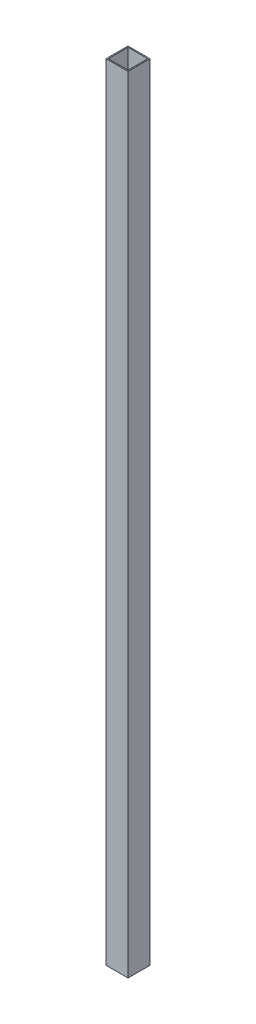
ISO-10303-21;
HEADER;
FILE_DESCRIPTION(('STEP AP214'),'2;1');
FILE_NAME('part.step','',(''),(''),'','','');
FILE_SCHEMA(('AUTOMOTIVE_DESIGN { 1 0 10303 214 1 1 1 1 }'));
ENDSEC;
DATA;
#1=APPLICATION_CONTEXT('core data for automotive mechanical design processes');
#2=APPLICATION_PROTOCOL_DEFINITION('international standard','automotive_design',2000,#1);
#3=PRODUCT_CONTEXT('',#1,'mechanical');
#4=PRODUCT('Part','Part','',(#3));
#5=PRODUCT_RELATED_PRODUCT_CATEGORY('part','',(#4));
#6=PRODUCT_DEFINITION_FORMATION('','',#4);
#7=PRODUCT_DEFINITION_CONTEXT('part definition',#1,'design');
#8=PRODUCT_DEFINITION('design','',#6,#7);
#9=PRODUCT_DEFINITION_SHAPE('','',#8);
#10=(LENGTH_UNIT() NAMED_UNIT(*) SI_UNIT(.MILLI.,.METRE.));
#11=(NAMED_UNIT(*) PLANE_ANGLE_UNIT() SI_UNIT($,.RADIAN.));
#12=(NAMED_UNIT(*) SI_UNIT($,.STERADIAN.) SOLID_ANGLE_UNIT());
#13=UNCERTAINTY_MEASURE_WITH_UNIT(LENGTH_MEASURE(1.E-05),#10,'distance_accuracy_value','');
#14=(GEOMETRIC_REPRESENTATION_CONTEXT(3) GLOBAL_UNCERTAINTY_ASSIGNED_CONTEXT((#13)) GLOBAL_UNIT_ASSIGNED_CONTEXT((#10,
#11,#12)) REPRESENTATION_CONTEXT('',''));
#15=CARTESIAN_POINT('',(0.,0.,0.));
#16=DIRECTION('',(0.,0.,1.));
#17=DIRECTION('',(1.,0.,0.));
#18=AXIS2_PLACEMENT_3D('',#15,#16,#17);
#19=CARTESIAN_POINT('',(0.,715.05,0.));
#20=DIRECTION('',(0.,1.,0.));
#21=DIRECTION('',(0.,0.,1.));
#22=AXIS2_PLACEMENT_3D('',#19,#20,#21);
#23=PLANE('',#22);
#24=DIRECTION('',(0.,0.,-1.));
#25=VECTOR('',#24,1.);
#26=CARTESIAN_POINT('',(10.,715.05,-10.));
#27=LINE('',#26,#25);
#28=CARTESIAN_POINT('',(10.,715.05,10.));
#29=VERTEX_POINT('',#28);
#30=CARTESIAN_POINT('',(10.,715.05,-10.));
#31=VERTEX_POINT('',#30);
#32=EDGE_CURVE('E153',#29,#31,#27,.T.);
#33=ORIENTED_EDGE('',*,*,#32,.T.);
#34=DIRECTION('',(-1.,0.,0.));
#35=VECTOR('',#34,1.);
#36=CARTESIAN_POINT('',(-10.,715.05,-10.));
#37=LINE('',#36,#35);
#38=CARTESIAN_POINT('',(-10.,715.05,-10.));
#39=VERTEX_POINT('',#38);
#40=EDGE_CURVE('E157',#31,#39,#37,.T.);
#41=ORIENTED_EDGE('',*,*,#40,.T.);
#42=DIRECTION('',(0.,0.,1.));
#43=VECTOR('',#42,1.);
#44=CARTESIAN_POINT('',(-10.,715.05,-10.));
#45=LINE('',#44,#43);
#46=CARTESIAN_POINT('',(-10.,715.05,10.));
#47=VERTEX_POINT('',#46);
#48=EDGE_CURVE('E161',#39,#47,#45,.T.);
#49=ORIENTED_EDGE('',*,*,#48,.T.);
#50=DIRECTION('',(1.,0.,0.));
#51=VECTOR('',#50,1.);
#52=CARTESIAN_POINT('',(-10.,715.05,10.));
#53=LINE('',#52,#51);
#54=EDGE_CURVE('E164',#47,#29,#53,.T.);
#55=ORIENTED_EDGE('',*,*,#54,.T.);
#56=EDGE_LOOP('',(#33,#41,#49,#55));
#57=FACE_BOUND('',#56,.T.);
#58=DIRECTION('',(-1.,0.,0.));
#59=VECTOR('',#58,1.);
#60=CARTESIAN_POINT('',(-9.,715.05,-9.));
#61=LINE('',#60,#59);
#62=CARTESIAN_POINT('',(9.,715.05,-9.));
#63=VERTEX_POINT('',#62);
#64=CARTESIAN_POINT('',(-9.,715.05,-9.));
#65=VERTEX_POINT('',#64);
#66=EDGE_CURVE('E114',#63,#65,#61,.T.);
#67=ORIENTED_EDGE('',*,*,#66,.F.);
#68=DIRECTION('',(0.,0.,-1.));
#69=VECTOR('',#68,1.);
#70=CARTESIAN_POINT('',(9.,715.05,-9.));
#71=LINE('',#70,#69);
#72=CARTESIAN_POINT('',(9.,715.05,9.));
#73=VERTEX_POINT('',#72);
#74=EDGE_CURVE('E105',#73,#63,#71,.T.);
#75=ORIENTED_EDGE('',*,*,#74,.F.);
#76=DIRECTION('',(1.,0.,0.));
#77=VECTOR('',#76,1.);
#78=CARTESIAN_POINT('',(-9.,715.05,9.));
#79=LINE('',#78,#77);
#80=CARTESIAN_POINT('',(-9.,715.05,9.));
#81=VERTEX_POINT('',#80);
#82=EDGE_CURVE('E131',#81,#73,#79,.T.);
#83=ORIENTED_EDGE('',*,*,#82,.F.);
#84=DIRECTION('',(0.,0.,1.));
#85=VECTOR('',#84,1.);
#86=CARTESIAN_POINT('',(-9.,715.05,-9.));
#87=LINE('',#86,#85);
#88=EDGE_CURVE('E127',#65,#81,#87,.T.);
#89=ORIENTED_EDGE('',*,*,#88,.F.);
#90=EDGE_LOOP('',(#67,#75,#83,#89));
#91=FACE_BOUND('',#90,.T.);
#92=ADVANCED_FACE('F39',(#57,#91),#23,.T.);
#93=CARTESIAN_POINT('',(0.,0.,0.));
#94=DIRECTION('',(0.,1.,0.));
#95=DIRECTION('',(0.,0.,1.));
#96=AXIS2_PLACEMENT_3D('',#93,#94,#95);
#97=PLANE('',#96);
#98=DIRECTION('',(0.,0.,-1.));
#99=VECTOR('',#98,1.);
#100=CARTESIAN_POINT('',(10.,0.,-10.));
#101=LINE('',#100,#99);
#102=CARTESIAN_POINT('',(10.,0.,10.));
#103=VERTEX_POINT('',#102);
#104=CARTESIAN_POINT('',(10.,0.,-10.));
#105=VERTEX_POINT('',#104);
#106=EDGE_CURVE('E123',#103,#105,#101,.T.);
#107=ORIENTED_EDGE('',*,*,#106,.F.);
#108=DIRECTION('',(1.,0.,0.));
#109=VECTOR('',#108,1.);
#110=CARTESIAN_POINT('',(-10.,0.,10.));
#111=LINE('',#110,#109);
#112=CARTESIAN_POINT('',(-10.,0.,10.));
#113=VERTEX_POINT('',#112);
#114=EDGE_CURVE('E158',#113,#103,#111,.T.);
#115=ORIENTED_EDGE('',*,*,#114,.F.);
#116=DIRECTION('',(0.,0.,1.));
#117=VECTOR('',#116,1.);
#118=CARTESIAN_POINT('',(-10.,0.,-10.));
#119=LINE('',#118,#117);
#120=CARTESIAN_POINT('',(-10.,0.,-10.));
#121=VERTEX_POINT('',#120);
#122=EDGE_CURVE('E174',#121,#113,#119,.T.);
#123=ORIENTED_EDGE('',*,*,#122,.F.);
#124=DIRECTION('',(-1.,0.,0.));
#125=VECTOR('',#124,1.);
#126=CARTESIAN_POINT('',(-10.,0.,-10.));
#127=LINE('',#126,#125);
#128=EDGE_CURVE('E171',#105,#121,#127,.T.);
#129=ORIENTED_EDGE('',*,*,#128,.F.);
#130=EDGE_LOOP('',(#107,#115,#123,#129));
#131=FACE_BOUND('',#130,.T.);
#132=DIRECTION('',(0.,0.,-1.));
#133=VECTOR('',#132,1.);
#134=CARTESIAN_POINT('',(9.,0.,-9.));
#135=LINE('',#134,#133);
#136=CARTESIAN_POINT('',(9.,0.,9.));
#137=VERTEX_POINT('',#136);
#138=CARTESIAN_POINT('',(9.,0.,-9.));
#139=VERTEX_POINT('',#138);
#140=EDGE_CURVE('E63',#137,#139,#135,.T.);
#141=ORIENTED_EDGE('',*,*,#140,.T.);
#142=DIRECTION('',(-1.,0.,0.));
#143=VECTOR('',#142,1.);
#144=CARTESIAN_POINT('',(-9.,0.,-9.));
#145=LINE('',#144,#143);
#146=CARTESIAN_POINT('',(-9.,0.,-9.));
#147=VERTEX_POINT('',#146);
#148=EDGE_CURVE('E121',#139,#147,#145,.T.);
#149=ORIENTED_EDGE('',*,*,#148,.T.);
#150=DIRECTION('',(0.,0.,1.));
#151=VECTOR('',#150,1.);
#152=CARTESIAN_POINT('',(-9.,0.,-9.));
#153=LINE('',#152,#151);
#154=CARTESIAN_POINT('',(-9.,0.,9.));
#155=VERTEX_POINT('',#154);
#156=EDGE_CURVE('E140',#147,#155,#153,.T.);
#157=ORIENTED_EDGE('',*,*,#156,.T.);
#158=DIRECTION('',(1.,0.,0.));
#159=VECTOR('',#158,1.);
#160=CARTESIAN_POINT('',(-9.,0.,9.));
#161=LINE('',#160,#159);
#162=EDGE_CURVE('E115',#155,#137,#161,.T.);
#163=ORIENTED_EDGE('',*,*,#162,.T.);
#164=EDGE_LOOP('',(#141,#149,#157,#163));
#165=FACE_BOUND('',#164,.T.);
#166=ADVANCED_FACE('F197',(#131,#165),#97,.F.);
#167=CARTESIAN_POINT('',(10.,715.05,-10.));
#168=DIRECTION('',(-1.,0.,0.));
#169=DIRECTION('',(0.,0.,1.));
#170=AXIS2_PLACEMENT_3D('',#167,#168,#169);
#171=PLANE('',#170);
#172=ORIENTED_EDGE('',*,*,#106,.T.);
#173=DIRECTION('',(0.,-1.,0.));
#174=VECTOR('',#173,1.);
#175=CARTESIAN_POINT('',(10.,715.05,-10.));
#176=LINE('',#175,#174);
#177=EDGE_CURVE('E11',#31,#105,#176,.T.);
#178=ORIENTED_EDGE('',*,*,#177,.F.);
#179=ORIENTED_EDGE('',*,*,#32,.F.);
#180=DIRECTION('',(0.,-1.,0.));
#181=VECTOR('',#180,1.);
#182=CARTESIAN_POINT('',(10.,715.05,10.));
#183=LINE('',#182,#181);
#184=EDGE_CURVE('E167',#29,#103,#183,.T.);
#185=ORIENTED_EDGE('',*,*,#184,.T.);
#186=EDGE_LOOP('',(#172,#178,#179,#185));
#187=FACE_BOUND('',#186,.T.);
#188=ADVANCED_FACE('F41',(#187),#171,.F.);
#189=CARTESIAN_POINT('',(-10.,715.05,-10.));
#190=DIRECTION('',(0.,0.,1.));
#191=DIRECTION('',(1.,0.,0.));
#192=AXIS2_PLACEMENT_3D('',#189,#190,#191);
#193=PLANE('',#192);
#194=ORIENTED_EDGE('',*,*,#128,.T.);
#195=DIRECTION('',(0.,-1.,0.));
#196=VECTOR('',#195,1.);
#197=CARTESIAN_POINT('',(-10.,715.05,-10.));
#198=LINE('',#197,#196);
#199=EDGE_CURVE('E48',#39,#121,#198,.T.);
#200=ORIENTED_EDGE('',*,*,#199,.F.);
#201=ORIENTED_EDGE('',*,*,#40,.F.);
#202=ORIENTED_EDGE('',*,*,#177,.T.);
#203=EDGE_LOOP('',(#194,#200,#201,#202));
#204=FACE_BOUND('',#203,.T.);
#205=ADVANCED_FACE('F207',(#204),#193,.F.);
#206=CARTESIAN_POINT('',(-10.,715.05,-10.));
#207=DIRECTION('',(1.,0.,0.));
#208=DIRECTION('',(0.,0.,-1.));
#209=AXIS2_PLACEMENT_3D('',#206,#207,#208);
#210=PLANE('',#209);
#211=ORIENTED_EDGE('',*,*,#122,.T.);
#212=DIRECTION('',(0.,-1.,0.));
#213=VECTOR('',#212,1.);
#214=CARTESIAN_POINT('',(-10.,715.05,10.));
#215=LINE('',#214,#213);
#216=EDGE_CURVE('E182',#47,#113,#215,.T.);
#217=ORIENTED_EDGE('',*,*,#216,.F.);
#218=ORIENTED_EDGE('',*,*,#48,.F.);
#219=ORIENTED_EDGE('',*,*,#199,.T.);
#220=EDGE_LOOP('',(#211,#217,#218,#219));
#221=FACE_BOUND('',#220,.T.);
#222=ADVANCED_FACE('F191',(#221),#210,.F.);
#223=CARTESIAN_POINT('',(-10.,715.05,10.));
#224=DIRECTION('',(0.,0.,-1.));
#225=DIRECTION('',(-1.,0.,0.));
#226=AXIS2_PLACEMENT_3D('',#223,#224,#225);
#227=PLANE('',#226);
#228=ORIENTED_EDGE('',*,*,#114,.T.);
#229=ORIENTED_EDGE('',*,*,#184,.F.);
#230=ORIENTED_EDGE('',*,*,#54,.F.);
#231=ORIENTED_EDGE('',*,*,#216,.T.);
#232=EDGE_LOOP('',(#228,#229,#230,#231));
#233=FACE_BOUND('',#232,.T.);
#234=ADVANCED_FACE('F201',(#233),#227,.F.);
#235=CARTESIAN_POINT('',(9.,715.05,-9.));
#236=DIRECTION('',(-1.,0.,0.));
#237=DIRECTION('',(0.,0.,1.));
#238=AXIS2_PLACEMENT_3D('',#235,#236,#237);
#239=PLANE('',#238);
#240=ORIENTED_EDGE('',*,*,#140,.F.);
#241=DIRECTION('',(0.,-1.,0.));
#242=VECTOR('',#241,1.);
#243=CARTESIAN_POINT('',(9.,715.05,9.));
#244=LINE('',#243,#242);
#245=EDGE_CURVE('E109',#73,#137,#244,.T.);
#246=ORIENTED_EDGE('',*,*,#245,.F.);
#247=ORIENTED_EDGE('',*,*,#74,.T.);
#248=DIRECTION('',(0.,-1.,0.));
#249=VECTOR('',#248,1.);
#250=CARTESIAN_POINT('',(9.,715.05,-9.));
#251=LINE('',#250,#249);
#252=EDGE_CURVE('E108',#63,#139,#251,.T.);
#253=ORIENTED_EDGE('',*,*,#252,.T.);
#254=EDGE_LOOP('',(#240,#246,#247,#253));
#255=FACE_BOUND('',#254,.T.);
#256=ADVANCED_FACE('F107',(#255),#239,.T.);
#257=CARTESIAN_POINT('',(-9.,715.05,-9.));
#258=DIRECTION('',(0.,0.,1.));
#259=DIRECTION('',(1.,0.,0.));
#260=AXIS2_PLACEMENT_3D('',#257,#258,#259);
#261=PLANE('',#260);
#262=ORIENTED_EDGE('',*,*,#148,.F.);
#263=ORIENTED_EDGE('',*,*,#252,.F.);
#264=ORIENTED_EDGE('',*,*,#66,.T.);
#265=DIRECTION('',(0.,-1.,0.));
#266=VECTOR('',#265,1.);
#267=CARTESIAN_POINT('',(-9.,715.05,-9.));
#268=LINE('',#267,#266);
#269=EDGE_CURVE('E124',#65,#147,#268,.T.);
#270=ORIENTED_EDGE('',*,*,#269,.T.);
#271=EDGE_LOOP('',(#262,#263,#264,#270));
#272=FACE_BOUND('',#271,.T.);
#273=ADVANCED_FACE('F118',(#272),#261,.T.);
#274=CARTESIAN_POINT('',(-9.,715.05,-9.));
#275=DIRECTION('',(1.,0.,0.));
#276=DIRECTION('',(0.,0.,-1.));
#277=AXIS2_PLACEMENT_3D('',#274,#275,#276);
#278=PLANE('',#277);
#279=ORIENTED_EDGE('',*,*,#156,.F.);
#280=ORIENTED_EDGE('',*,*,#269,.F.);
#281=ORIENTED_EDGE('',*,*,#88,.T.);
#282=DIRECTION('',(0.,-1.,0.));
#283=VECTOR('',#282,1.);
#284=CARTESIAN_POINT('',(-9.,715.05,9.));
#285=LINE('',#284,#283);
#286=EDGE_CURVE('E55',#81,#155,#285,.T.);
#287=ORIENTED_EDGE('',*,*,#286,.T.);
#288=EDGE_LOOP('',(#279,#280,#281,#287));
#289=FACE_BOUND('',#288,.T.);
#290=ADVANCED_FACE('F230',(#289),#278,.T.);
#291=CARTESIAN_POINT('',(-9.,715.05,9.));
#292=DIRECTION('',(0.,0.,-1.));
#293=DIRECTION('',(-1.,0.,0.));
#294=AXIS2_PLACEMENT_3D('',#291,#292,#293);
#295=PLANE('',#294);
#296=ORIENTED_EDGE('',*,*,#162,.F.);
#297=ORIENTED_EDGE('',*,*,#286,.F.);
#298=ORIENTED_EDGE('',*,*,#82,.T.);
#299=ORIENTED_EDGE('',*,*,#245,.T.);
#300=EDGE_LOOP('',(#296,#297,#298,#299));
#301=FACE_BOUND('',#300,.T.);
#302=ADVANCED_FACE('F234',(#301),#295,.T.);
#303=CLOSED_SHELL('',(#92,#166,#188,#205,#222,#234,#256,#273,#290,#302));
#304=MANIFOLD_SOLID_BREP('B2',#303);
#305=ADVANCED_BREP_SHAPE_REPRESENTATION('',(#18,#304),#14);
#306=SHAPE_DEFINITION_REPRESENTATION(#9,#305);
ENDSEC;
END-ISO-10303-21;
